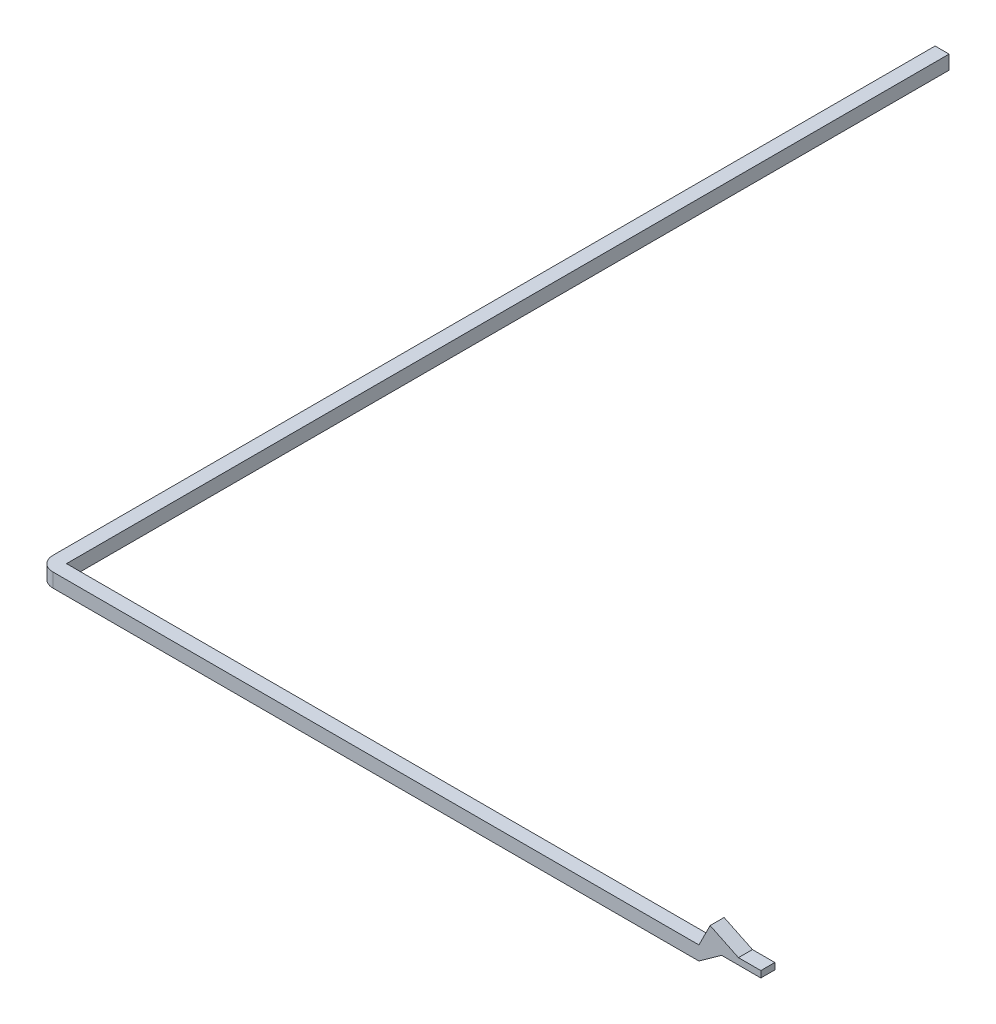
ISO-10303-21;
HEADER;
FILE_DESCRIPTION(('STEP AP214'),'2;1');
FILE_NAME('part.step','',(''),(''),'','','');
FILE_SCHEMA(('AUTOMOTIVE_DESIGN { 1 0 10303 214 1 1 1 1 }'));
ENDSEC;
DATA;
#1=APPLICATION_CONTEXT('core data for automotive mechanical design processes');
#2=APPLICATION_PROTOCOL_DEFINITION('international standard','automotive_design',2000,#1);
#3=PRODUCT_CONTEXT('',#1,'mechanical');
#4=PRODUCT('Part','Part','',(#3));
#5=PRODUCT_RELATED_PRODUCT_CATEGORY('part','',(#4));
#6=PRODUCT_DEFINITION_FORMATION('','',#4);
#7=PRODUCT_DEFINITION_CONTEXT('part definition',#1,'design');
#8=PRODUCT_DEFINITION('design','',#6,#7);
#9=PRODUCT_DEFINITION_SHAPE('','',#8);
#10=(LENGTH_UNIT() NAMED_UNIT(*) SI_UNIT(.MILLI.,.METRE.));
#11=(NAMED_UNIT(*) PLANE_ANGLE_UNIT() SI_UNIT($,.RADIAN.));
#12=(NAMED_UNIT(*) SI_UNIT($,.STERADIAN.) SOLID_ANGLE_UNIT());
#13=UNCERTAINTY_MEASURE_WITH_UNIT(LENGTH_MEASURE(1.E-05),#10,'distance_accuracy_value','');
#14=(GEOMETRIC_REPRESENTATION_CONTEXT(3) GLOBAL_UNCERTAINTY_ASSIGNED_CONTEXT((#13)) GLOBAL_UNIT_ASSIGNED_CONTEXT((#10,
#11,#12)) REPRESENTATION_CONTEXT('',''));
#15=CARTESIAN_POINT('',(0.,0.,0.));
#16=DIRECTION('',(0.,0.,1.));
#17=DIRECTION('',(1.,0.,0.));
#18=AXIS2_PLACEMENT_3D('',#15,#16,#17);
#19=CARTESIAN_POINT('',(0.,-0.25,16.275));
#20=DIRECTION('',(0.,-1.,0.));
#21=DIRECTION('',(0.,0.,-1.));
#22=AXIS2_PLACEMENT_3D('',#19,#20,#21);
#23=PLANE('',#22);
#24=DIRECTION('',(0.,0.,1.));
#25=VECTOR('',#24,1.);
#26=CARTESIAN_POINT('',(0.,-0.25,0.));
#27=LINE('',#26,#25);
#28=CARTESIAN_POINT('',(0.,-0.25,-15.765));
#29=VERTEX_POINT('',#28);
#30=CARTESIAN_POINT('',(0.,-0.25,15.765));
#31=VERTEX_POINT('',#30);
#32=EDGE_CURVE('E169',#29,#31,#27,.T.);
#33=ORIENTED_EDGE('',*,*,#32,.F.);
#34=DIRECTION('',(-1.,0.,0.));
#35=VECTOR('',#34,1.);
#36=CARTESIAN_POINT('',(0.250000000000005,-0.25,-15.765));
#37=LINE('',#36,#35);
#38=CARTESIAN_POINT('',(0.5,-0.25,-15.765));
#39=VERTEX_POINT('',#38);
#40=EDGE_CURVE('E179',#39,#29,#37,.T.);
#41=ORIENTED_EDGE('',*,*,#40,.F.);
#42=DIRECTION('',(0.,0.,-1.));
#43=VECTOR('',#42,1.);
#44=CARTESIAN_POINT('',(0.5,-0.25,0.));
#45=LINE('',#44,#43);
#46=CARTESIAN_POINT('',(0.5,-0.25,15.765));
#47=VERTEX_POINT('',#46);
#48=EDGE_CURVE('E185',#47,#39,#45,.T.);
#49=ORIENTED_EDGE('',*,*,#48,.F.);
#50=CARTESIAN_POINT('',(0.51000000000001,-0.25,15.765));
#51=DIRECTION('',(0.,-1.,0.));
#52=DIRECTION('',(0.,0.,-1.));
#53=AXIS2_PLACEMENT_3D('',#50,#51,#52);
#54=CIRCLE('',#53,0.00999999999999981);
#55=CARTESIAN_POINT('',(0.51000000000001,-0.25,15.775));
#56=VERTEX_POINT('',#55);
#57=EDGE_CURVE('E186',#56,#47,#54,.T.);
#58=ORIENTED_EDGE('',*,*,#57,.F.);
#59=DIRECTION('',(-1.,0.,0.));
#60=VECTOR('',#59,1.);
#61=CARTESIAN_POINT('',(13.1613661304494,-0.25,15.775));
#62=LINE('',#61,#60);
#63=CARTESIAN_POINT('',(23.6,-0.249999999999998,15.775));
#64=VERTEX_POINT('',#63);
#65=EDGE_CURVE('E196',#64,#56,#62,.T.);
#66=ORIENTED_EDGE('',*,*,#65,.F.);
#67=DIRECTION('',(0.,0.,-1.));
#68=VECTOR('',#67,1.);
#69=CARTESIAN_POINT('',(23.6,-0.25,16.025));
#70=LINE('',#69,#68);
#71=CARTESIAN_POINT('',(23.6,-0.250000000000001,16.275));
#72=VERTEX_POINT('',#71);
#73=EDGE_CURVE('E222',#72,#64,#70,.T.);
#74=ORIENTED_EDGE('',*,*,#73,.F.);
#75=DIRECTION('',(1.,0.,0.));
#76=VECTOR('',#75,1.);
#77=CARTESIAN_POINT('',(13.1613661304494,-0.25,16.275));
#78=LINE('',#77,#76);
#79=CARTESIAN_POINT('',(0.51000000000001,-0.25,16.275));
#80=VERTEX_POINT('',#79);
#81=EDGE_CURVE('E164',#80,#72,#78,.T.);
#82=ORIENTED_EDGE('',*,*,#81,.F.);
#83=CARTESIAN_POINT('',(0.51000000000001,-0.25,15.765));
#84=DIRECTION('',(0.,-1.,0.));
#85=DIRECTION('',(0.,0.,-1.));
#86=AXIS2_PLACEMENT_3D('',#83,#84,#85);
#87=CIRCLE('',#86,0.509999999999998);
#88=EDGE_CURVE('E165',#31,#80,#87,.F.);
#89=ORIENTED_EDGE('',*,*,#88,.F.);
#90=EDGE_LOOP('',(#33,#41,#49,#58,#66,#74,#82,#89));
#91=FACE_BOUND('',#90,.T.);
#92=ADVANCED_FACE('F15',(#91),#23,.T.);
#93=CARTESIAN_POINT('',(23.6,-0.25,15.775));
#94=DIRECTION('',(0.582637341829642,-0.812732260898809,0.));
#95=DIRECTION('',(0.812732260898808,0.582637341829642,0.));
#96=AXIS2_PLACEMENT_3D('',#93,#94,#95);
#97=PLANE('',#96);
#98=DIRECTION('',(-0.812732260898766,-0.5826373418297,0.));
#99=VECTOR('',#98,1.);
#100=CARTESIAN_POINT('',(24.4127322608987,0.332637341829634,15.775));
#101=LINE('',#100,#99);
#102=CARTESIAN_POINT('',(24.4127322608987,0.332637341829636,15.775));
#103=VERTEX_POINT('',#102);
#104=EDGE_CURVE('E249',#103,#64,#101,.T.);
#105=ORIENTED_EDGE('',*,*,#104,.F.);
#106=DIRECTION('',(0.,0.,-1.));
#107=VECTOR('',#106,1.);
#108=CARTESIAN_POINT('',(24.4127322608988,0.33263734182964,16.025));
#109=LINE('',#108,#107);
#110=CARTESIAN_POINT('',(24.4127322608987,0.332637341829637,16.275));
#111=VERTEX_POINT('',#110);
#112=EDGE_CURVE('E214',#111,#103,#109,.T.);
#113=ORIENTED_EDGE('',*,*,#112,.F.);
#114=DIRECTION('',(0.812732260898766,0.5826373418297,0.));
#115=VECTOR('',#114,1.);
#116=CARTESIAN_POINT('',(23.6,-0.25,16.275));
#117=LINE('',#116,#115);
#118=EDGE_CURVE('E193',#72,#111,#117,.T.);
#119=ORIENTED_EDGE('',*,*,#118,.F.);
#120=ORIENTED_EDGE('',*,*,#73,.T.);
#121=EDGE_LOOP('',(#105,#113,#119,#120));
#122=FACE_BOUND('',#121,.T.);
#123=ADVANCED_FACE('F263',(#122),#97,.T.);
#124=CARTESIAN_POINT('',(24.4127322608988,0.33263734182964,15.775));
#125=DIRECTION('',(0.,-1.,0.));
#126=DIRECTION('',(1.,0.,0.));
#127=AXIS2_PLACEMENT_3D('',#124,#125,#126);
#128=PLANE('',#127);
#129=DIRECTION('',(-1.,0.,0.));
#130=VECTOR('',#129,1.);
#131=CARTESIAN_POINT('',(13.1613661304494,0.332637341829634,15.775));
#132=LINE('',#131,#130);
#133=CARTESIAN_POINT('',(25.8127322608988,0.332637341829639,15.775));
#134=VERTEX_POINT('',#133);
#135=EDGE_CURVE('E245',#134,#103,#132,.T.);
#136=ORIENTED_EDGE('',*,*,#135,.F.);
#137=DIRECTION('',(0.,0.,-1.));
#138=VECTOR('',#137,1.);
#139=CARTESIAN_POINT('',(25.8127322608988,0.33263734182964,16.025));
#140=LINE('',#139,#138);
#141=CARTESIAN_POINT('',(25.8127322608988,0.332637341829636,16.275));
#142=VERTEX_POINT('',#141);
#143=EDGE_CURVE('E205',#142,#134,#140,.T.);
#144=ORIENTED_EDGE('',*,*,#143,.F.);
#145=DIRECTION('',(1.,0.,0.));
#146=VECTOR('',#145,1.);
#147=CARTESIAN_POINT('',(13.1613661304494,0.332637341829634,16.275));
#148=LINE('',#147,#146);
#149=EDGE_CURVE('E210',#111,#142,#148,.T.);
#150=ORIENTED_EDGE('',*,*,#149,.F.);
#151=ORIENTED_EDGE('',*,*,#112,.T.);
#152=EDGE_LOOP('',(#136,#144,#150,#151));
#153=FACE_BOUND('',#152,.T.);
#154=ADVANCED_FACE('F284',(#153),#128,.T.);
#155=CARTESIAN_POINT('',(25.8127322608988,0.33263734182964,16.275));
#156=DIRECTION('',(1.,0.,0.));
#157=DIRECTION('',(0.,0.,-1.));
#158=AXIS2_PLACEMENT_3D('',#155,#156,#157);
#159=PLANE('',#158);
#160=DIRECTION('',(0.,-1.,0.));
#161=VECTOR('',#160,1.);
#162=CARTESIAN_POINT('',(25.8127322608988,0.4,15.775));
#163=LINE('',#162,#161);
#164=CARTESIAN_POINT('',(25.8127322608988,0.562637341829639,15.775));
#165=VERTEX_POINT('',#164);
#166=EDGE_CURVE('E240',#165,#134,#163,.T.);
#167=ORIENTED_EDGE('',*,*,#166,.F.);
#168=DIRECTION('',(0.,0.,-1.));
#169=VECTOR('',#168,1.);
#170=CARTESIAN_POINT('',(25.8127322608988,0.56263734182964,16.025));
#171=LINE('',#170,#169);
#172=CARTESIAN_POINT('',(25.8127322608988,0.562637341829639,16.275));
#173=VERTEX_POINT('',#172);
#174=EDGE_CURVE('E197',#173,#165,#171,.T.);
#175=ORIENTED_EDGE('',*,*,#174,.F.);
#176=DIRECTION('',(0.,1.,0.));
#177=VECTOR('',#176,1.);
#178=CARTESIAN_POINT('',(25.8127322608988,0.4,16.275));
#179=LINE('',#178,#177);
#180=EDGE_CURVE('E201',#142,#173,#179,.T.);
#181=ORIENTED_EDGE('',*,*,#180,.F.);
#182=ORIENTED_EDGE('',*,*,#143,.T.);
#183=EDGE_LOOP('',(#167,#175,#181,#182));
#184=FACE_BOUND('',#183,.T.);
#185=ADVANCED_FACE('F287',(#184),#159,.T.);
#186=CARTESIAN_POINT('',(25.8127322608988,0.56263734182964,15.775));
#187=DIRECTION('',(0.,1.,0.));
#188=DIRECTION('',(-1.,0.,0.));
#189=AXIS2_PLACEMENT_3D('',#186,#187,#188);
#190=PLANE('',#189);
#191=DIRECTION('',(1.,0.,0.));
#192=VECTOR('',#191,1.);
#193=CARTESIAN_POINT('',(13.1613661304494,0.562637341829638,15.775));
#194=LINE('',#193,#192);
#195=CARTESIAN_POINT('',(25.0127322608988,0.56263734182964,15.775));
#196=VERTEX_POINT('',#195);
#197=EDGE_CURVE('E237',#196,#165,#194,.T.);
#198=ORIENTED_EDGE('',*,*,#197,.F.);
#199=DIRECTION('',(0.,0.,-1.));
#200=VECTOR('',#199,1.);
#201=CARTESIAN_POINT('',(25.0127322608988,0.56263734182964,16.025));
#202=LINE('',#201,#200);
#203=CARTESIAN_POINT('',(25.0127322608988,0.562637341829639,16.275));
#204=VERTEX_POINT('',#203);
#205=EDGE_CURVE('E194',#204,#196,#202,.T.);
#206=ORIENTED_EDGE('',*,*,#205,.F.);
#207=DIRECTION('',(-1.,0.,0.));
#208=VECTOR('',#207,1.);
#209=CARTESIAN_POINT('',(13.1613661304494,0.562637341829638,16.275));
#210=LINE('',#209,#208);
#211=EDGE_CURVE('E198',#173,#204,#210,.T.);
#212=ORIENTED_EDGE('',*,*,#211,.F.);
#213=ORIENTED_EDGE('',*,*,#174,.T.);
#214=EDGE_LOOP('',(#198,#206,#212,#213));
#215=FACE_BOUND('',#214,.T.);
#216=ADVANCED_FACE('F291',(#215),#190,.T.);
#217=CARTESIAN_POINT('',(25.0127322608988,0.56263734182964,15.775));
#218=DIRECTION('',(0.43363563119001,0.901088308304154,0.));
#219=DIRECTION('',(-0.901088308304154,0.43363563119001,0.));
#220=AXIS2_PLACEMENT_3D('',#217,#218,#219);
#221=PLANE('',#220);
#222=DIRECTION('',(0.90108830830413,-0.433635631190059,0.));
#223=VECTOR('',#222,1.);
#224=CARTESIAN_POINT('',(24.0000000000001,1.05,15.775));
#225=LINE('',#224,#223);
#226=CARTESIAN_POINT('',(24.,1.05000000000001,15.775));
#227=VERTEX_POINT('',#226);
#228=EDGE_CURVE('E19',#227,#196,#225,.T.);
#229=ORIENTED_EDGE('',*,*,#228,.F.);
#230=DIRECTION('',(0.,0.,-1.));
#231=VECTOR('',#230,1.);
#232=CARTESIAN_POINT('',(24.,1.05,16.025));
#233=LINE('',#232,#231);
#234=CARTESIAN_POINT('',(24.,1.05000000000001,16.275));
#235=VERTEX_POINT('',#234);
#236=EDGE_CURVE('E129',#235,#227,#233,.T.);
#237=ORIENTED_EDGE('',*,*,#236,.F.);
#238=DIRECTION('',(-0.90108830830413,0.433635631190059,0.));
#239=VECTOR('',#238,1.);
#240=CARTESIAN_POINT('',(25.0127322608987,0.562637341829638,16.275));
#241=LINE('',#240,#239);
#242=EDGE_CURVE('E154',#204,#235,#241,.T.);
#243=ORIENTED_EDGE('',*,*,#242,.F.);
#244=ORIENTED_EDGE('',*,*,#205,.T.);
#245=EDGE_LOOP('',(#229,#237,#243,#244));
#246=FACE_BOUND('',#245,.T.);
#247=ADVANCED_FACE('F293',(#246),#221,.T.);
#248=CARTESIAN_POINT('',(25.8127322608988,-0.25,15.775));
#249=DIRECTION('',(0.,0.,-1.));
#250=DIRECTION('',(-1.,0.,0.));
#251=AXIS2_PLACEMENT_3D('',#248,#249,#250);
#252=PLANE('',#251);
#253=ORIENTED_EDGE('',*,*,#135,.T.);
#254=ORIENTED_EDGE('',*,*,#104,.T.);
#255=ORIENTED_EDGE('',*,*,#65,.T.);
#256=DIRECTION('',(0.,-1.,0.));
#257=VECTOR('',#256,1.);
#258=CARTESIAN_POINT('',(0.51000000000001,0.,15.775));
#259=LINE('',#258,#257);
#260=CARTESIAN_POINT('',(0.51000000000001,0.25,15.775));
#261=VERTEX_POINT('',#260);
#262=EDGE_CURVE('E120',#261,#56,#259,.T.);
#263=ORIENTED_EDGE('',*,*,#262,.F.);
#264=DIRECTION('',(-1.,0.,0.));
#265=VECTOR('',#264,1.);
#266=CARTESIAN_POINT('',(11.8009210421044,0.25,15.7750000000001));
#267=LINE('',#266,#265);
#268=CARTESIAN_POINT('',(23.6018420842087,0.25,15.775));
#269=VERTEX_POINT('',#268);
#270=EDGE_CURVE('E112',#269,#261,#267,.T.);
#271=ORIENTED_EDGE('',*,*,#270,.F.);
#272=DIRECTION('',(-0.445563709024475,-0.895250233845461,0.));
#273=VECTOR('',#272,1.);
#274=CARTESIAN_POINT('',(23.8009210421043,0.65,15.775));
#275=LINE('',#274,#273);
#276=EDGE_CURVE('E116',#227,#269,#275,.T.);
#277=ORIENTED_EDGE('',*,*,#276,.F.);
#278=ORIENTED_EDGE('',*,*,#228,.T.);
#279=ORIENTED_EDGE('',*,*,#197,.T.);
#280=ORIENTED_EDGE('',*,*,#166,.T.);
#281=EDGE_LOOP('',(#253,#254,#255,#263,#271,#277,#278,#279,#280));
#282=FACE_BOUND('',#281,.T.);
#283=ADVANCED_FACE('F115',(#282),#252,.T.);
#284=CARTESIAN_POINT('',(0.51000000000001,0.3,15.765));
#285=DIRECTION('',(0.,-1.,0.));
#286=DIRECTION('',(0.,0.,-1.));
#287=AXIS2_PLACEMENT_3D('',#284,#285,#286);
#288=CYLINDRICAL_SURFACE('',#287,0.00999999999999981);
#289=CARTESIAN_POINT('',(0.51000000000001,0.25,15.765));
#290=DIRECTION('',(0.,-1.,0.));
#291=DIRECTION('',(0.,0.,-1.));
#292=AXIS2_PLACEMENT_3D('',#289,#290,#291);
#293=CIRCLE('',#292,0.00999999999999981);
#294=CARTESIAN_POINT('',(0.500000000000029,0.25,15.765));
#295=VERTEX_POINT('',#294);
#296=EDGE_CURVE('E124',#261,#295,#293,.T.);
#297=ORIENTED_EDGE('',*,*,#296,.F.);
#298=ORIENTED_EDGE('',*,*,#262,.T.);
#299=ORIENTED_EDGE('',*,*,#57,.T.);
#300=DIRECTION('',(0.,-1.,0.));
#301=VECTOR('',#300,1.);
#302=CARTESIAN_POINT('',(0.5,0.,15.765));
#303=LINE('',#302,#301);
#304=EDGE_CURVE('E180',#295,#47,#303,.T.);
#305=ORIENTED_EDGE('',*,*,#304,.F.);
#306=EDGE_LOOP('',(#297,#298,#299,#305));
#307=FACE_BOUND('',#306,.T.);
#308=ADVANCED_FACE('F269',(#307),#288,.F.);
#309=CARTESIAN_POINT('',(0.5,-0.25,15.765));
#310=DIRECTION('',(1.,0.,0.));
#311=DIRECTION('',(0.,0.,-1.));
#312=AXIS2_PLACEMENT_3D('',#309,#310,#311);
#313=PLANE('',#312);
#314=DIRECTION('',(0.,0.,-1.));
#315=VECTOR('',#314,1.);
#316=CARTESIAN_POINT('',(0.500000000000057,0.25,0.254999999999998));
#317=LINE('',#316,#315);
#318=CARTESIAN_POINT('',(0.500000000000038,0.25,-15.765));
#319=VERTEX_POINT('',#318);
#320=EDGE_CURVE('E146',#295,#319,#317,.T.);
#321=ORIENTED_EDGE('',*,*,#320,.F.);
#322=ORIENTED_EDGE('',*,*,#304,.T.);
#323=ORIENTED_EDGE('',*,*,#48,.T.);
#324=DIRECTION('',(0.,-1.,0.));
#325=VECTOR('',#324,1.);
#326=CARTESIAN_POINT('',(0.5,0.,-15.765));
#327=LINE('',#326,#325);
#328=EDGE_CURVE('E176',#319,#39,#327,.T.);
#329=ORIENTED_EDGE('',*,*,#328,.F.);
#330=EDGE_LOOP('',(#321,#322,#323,#329));
#331=FACE_BOUND('',#330,.T.);
#332=ADVANCED_FACE('F272',(#331),#313,.T.);
#333=CARTESIAN_POINT('',(0.,-0.25,-15.765));
#334=DIRECTION('',(0.,0.,-1.));
#335=DIRECTION('',(0.,1.,0.));
#336=AXIS2_PLACEMENT_3D('',#333,#334,#335);
#337=PLANE('',#336);
#338=ORIENTED_EDGE('',*,*,#328,.T.);
#339=ORIENTED_EDGE('',*,*,#40,.T.);
#340=DIRECTION('',(0.,-1.,0.));
#341=VECTOR('',#340,1.);
#342=CARTESIAN_POINT('',(0.,0.,-15.765));
#343=LINE('',#342,#341);
#344=CARTESIAN_POINT('',(0.,0.25,-15.765));
#345=VERTEX_POINT('',#344);
#346=EDGE_CURVE('E166',#345,#29,#343,.T.);
#347=ORIENTED_EDGE('',*,*,#346,.F.);
#348=DIRECTION('',(-1.,0.,0.));
#349=VECTOR('',#348,1.);
#350=CARTESIAN_POINT('',(11.8009210421044,0.25,-15.765));
#351=LINE('',#350,#349);
#352=EDGE_CURVE('E143',#319,#345,#351,.T.);
#353=ORIENTED_EDGE('',*,*,#352,.F.);
#354=EDGE_LOOP('',(#338,#339,#347,#353));
#355=FACE_BOUND('',#354,.T.);
#356=ADVANCED_FACE('F276',(#355),#337,.T.);
#357=CARTESIAN_POINT('',(0.,-0.25,-15.765));
#358=DIRECTION('',(-1.,0.,0.));
#359=DIRECTION('',(0.,0.,1.));
#360=AXIS2_PLACEMENT_3D('',#357,#358,#359);
#361=PLANE('',#360);
#362=DIRECTION('',(0.,0.,1.));
#363=VECTOR('',#362,1.);
#364=CARTESIAN_POINT('',(0.,0.25,0.254999999999998));
#365=LINE('',#364,#363);
#366=CARTESIAN_POINT('',(0.,0.25,15.765));
#367=VERTEX_POINT('',#366);
#368=EDGE_CURVE('E137',#345,#367,#365,.T.);
#369=ORIENTED_EDGE('',*,*,#368,.F.);
#370=ORIENTED_EDGE('',*,*,#346,.T.);
#371=ORIENTED_EDGE('',*,*,#32,.T.);
#372=DIRECTION('',(0.,-1.,0.));
#373=VECTOR('',#372,1.);
#374=CARTESIAN_POINT('',(0.,0.,15.765));
#375=LINE('',#374,#373);
#376=EDGE_CURVE('E161',#367,#31,#375,.T.);
#377=ORIENTED_EDGE('',*,*,#376,.F.);
#378=EDGE_LOOP('',(#369,#370,#371,#377));
#379=FACE_BOUND('',#378,.T.);
#380=ADVANCED_FACE('F278',(#379),#361,.T.);
#381=CARTESIAN_POINT('',(0.51000000000001,0.3,15.765));
#382=DIRECTION('',(0.,-1.,0.));
#383=DIRECTION('',(0.,0.,-1.));
#384=AXIS2_PLACEMENT_3D('',#381,#382,#383);
#385=CYLINDRICAL_SURFACE('',#384,0.509999999999998);
#386=CARTESIAN_POINT('',(0.51000000000001,0.25,15.765));
#387=DIRECTION('',(0.,-1.,0.));
#388=DIRECTION('',(0.,0.,-1.));
#389=AXIS2_PLACEMENT_3D('',#386,#387,#388);
#390=CIRCLE('',#389,0.509999999999998);
#391=CARTESIAN_POINT('',(0.51000000000001,0.25,16.275));
#392=VERTEX_POINT('',#391);
#393=EDGE_CURVE('E134',#367,#392,#390,.F.);
#394=ORIENTED_EDGE('',*,*,#393,.F.);
#395=ORIENTED_EDGE('',*,*,#376,.T.);
#396=ORIENTED_EDGE('',*,*,#88,.T.);
#397=DIRECTION('',(0.,-1.,0.));
#398=VECTOR('',#397,1.);
#399=CARTESIAN_POINT('',(0.51000000000001,0.4,16.275));
#400=LINE('',#399,#398);
#401=EDGE_CURVE('E153',#392,#80,#400,.T.);
#402=ORIENTED_EDGE('',*,*,#401,.F.);
#403=EDGE_LOOP('',(#394,#395,#396,#402));
#404=FACE_BOUND('',#403,.T.);
#405=ADVANCED_FACE('F280',(#404),#385,.T.);
#406=CARTESIAN_POINT('',(0.51000000000001,-0.25,16.275));
#407=DIRECTION('',(0.,0.,1.));
#408=DIRECTION('',(1.,0.,0.));
#409=AXIS2_PLACEMENT_3D('',#406,#407,#408);
#410=PLANE('',#409);
#411=DIRECTION('',(1.,0.,0.));
#412=VECTOR('',#411,1.);
#413=CARTESIAN_POINT('',(11.8009210421044,0.25,16.275));
#414=LINE('',#413,#412);
#415=CARTESIAN_POINT('',(23.6018420842087,0.25,16.275));
#416=VERTEX_POINT('',#415);
#417=EDGE_CURVE('E25',#392,#416,#414,.T.);
#418=ORIENTED_EDGE('',*,*,#417,.F.);
#419=ORIENTED_EDGE('',*,*,#401,.T.);
#420=ORIENTED_EDGE('',*,*,#81,.T.);
#421=ORIENTED_EDGE('',*,*,#118,.T.);
#422=ORIENTED_EDGE('',*,*,#149,.T.);
#423=ORIENTED_EDGE('',*,*,#180,.T.);
#424=ORIENTED_EDGE('',*,*,#211,.T.);
#425=ORIENTED_EDGE('',*,*,#242,.T.);
#426=DIRECTION('',(0.445563709024475,0.895250233845461,0.));
#427=VECTOR('',#426,1.);
#428=CARTESIAN_POINT('',(23.8009210421043,0.65,16.275));
#429=LINE('',#428,#427);
#430=EDGE_CURVE('E34',#416,#235,#429,.T.);
#431=ORIENTED_EDGE('',*,*,#430,.F.);
#432=EDGE_LOOP('',(#418,#419,#420,#421,#422,#423,#424,#425,#431));
#433=FACE_BOUND('',#432,.T.);
#434=ADVANCED_FACE('F281',(#433),#410,.T.);
#435=CARTESIAN_POINT('',(24.,1.05,15.775));
#436=DIRECTION('',(-0.895250233845461,0.445563709024475,0.));
#437=DIRECTION('',(-0.445563709024475,-0.895250233845461,0.));
#438=AXIS2_PLACEMENT_3D('',#435,#436,#437);
#439=PLANE('',#438);
#440=ORIENTED_EDGE('',*,*,#276,.T.);
#441=DIRECTION('',(0.,0.,-1.));
#442=VECTOR('',#441,1.);
#443=CARTESIAN_POINT('',(23.6018420842087,0.25,0.254999999999998));
#444=LINE('',#443,#442);
#445=EDGE_CURVE('E10',#416,#269,#444,.T.);
#446=ORIENTED_EDGE('',*,*,#445,.F.);
#447=ORIENTED_EDGE('',*,*,#430,.T.);
#448=ORIENTED_EDGE('',*,*,#236,.T.);
#449=EDGE_LOOP('',(#440,#446,#447,#448));
#450=FACE_BOUND('',#449,.T.);
#451=ADVANCED_FACE('F127',(#450),#439,.T.);
#452=CARTESIAN_POINT('',(0.,0.25,16.275));
#453=DIRECTION('',(0.,1.,0.));
#454=DIRECTION('',(1.,0.,0.));
#455=AXIS2_PLACEMENT_3D('',#452,#453,#454);
#456=PLANE('',#455);
#457=ORIENTED_EDGE('',*,*,#417,.T.);
#458=ORIENTED_EDGE('',*,*,#445,.T.);
#459=ORIENTED_EDGE('',*,*,#270,.T.);
#460=ORIENTED_EDGE('',*,*,#296,.T.);
#461=ORIENTED_EDGE('',*,*,#320,.T.);
#462=ORIENTED_EDGE('',*,*,#352,.T.);
#463=ORIENTED_EDGE('',*,*,#368,.T.);
#464=ORIENTED_EDGE('',*,*,#393,.T.);
#465=EDGE_LOOP('',(#457,#458,#459,#460,#461,#462,#463,#464));
#466=FACE_BOUND('',#465,.T.);
#467=ADVANCED_FACE('F17',(#466),#456,.T.);
#468=CLOSED_SHELL('',(#92,#123,#154,#185,#216,#247,#283,#308,#332,#356,#380,#405,#434,#451,#467));
#469=MANIFOLD_SOLID_BREP('B1',#468);
#470=ADVANCED_BREP_SHAPE_REPRESENTATION('',(#18,#469),#14);
#471=SHAPE_DEFINITION_REPRESENTATION(#9,#470);
ENDSEC;
END-ISO-10303-21;
